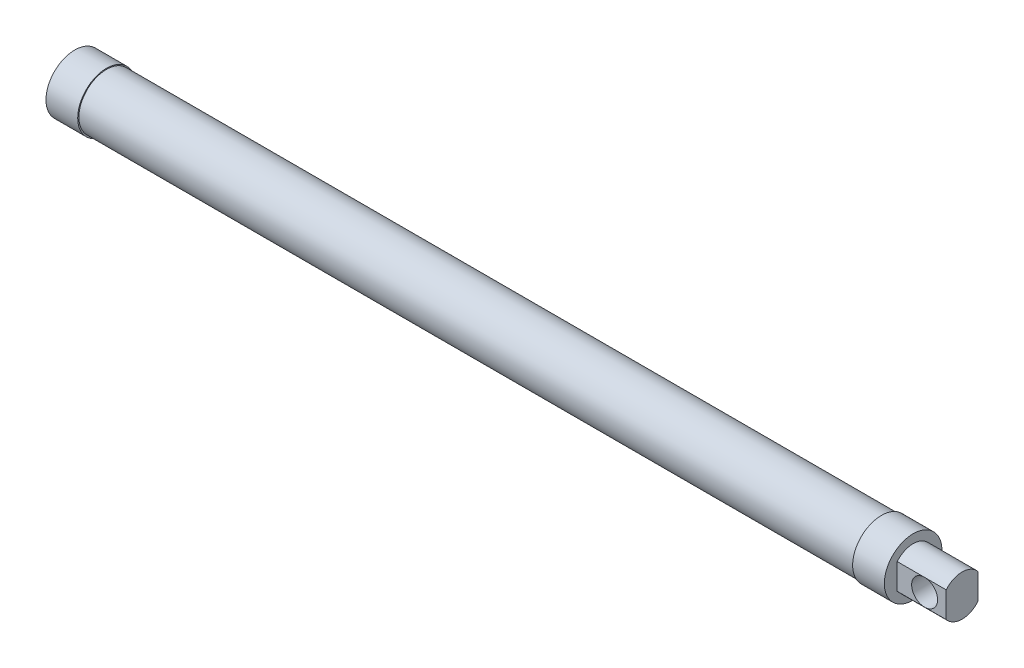
ISO-10303-21;
HEADER;
FILE_DESCRIPTION(('STEP AP214'),'2;1');
FILE_NAME('part.step','',(''),(''),'','','');
FILE_SCHEMA(('AUTOMOTIVE_DESIGN { 1 0 10303 214 1 1 1 1 }'));
ENDSEC;
DATA;
#1=APPLICATION_CONTEXT('core data for automotive mechanical design processes');
#2=APPLICATION_PROTOCOL_DEFINITION('international standard','automotive_design',2000,#1);
#3=PRODUCT_CONTEXT('',#1,'mechanical');
#4=PRODUCT('Part','Part','',(#3));
#5=PRODUCT_RELATED_PRODUCT_CATEGORY('part','',(#4));
#6=PRODUCT_DEFINITION_FORMATION('','',#4);
#7=PRODUCT_DEFINITION_CONTEXT('part definition',#1,'design');
#8=PRODUCT_DEFINITION('design','',#6,#7);
#9=PRODUCT_DEFINITION_SHAPE('','',#8);
#10=(LENGTH_UNIT() NAMED_UNIT(*) SI_UNIT(.MILLI.,.METRE.));
#11=(NAMED_UNIT(*) PLANE_ANGLE_UNIT() SI_UNIT($,.RADIAN.));
#12=(NAMED_UNIT(*) SI_UNIT($,.STERADIAN.) SOLID_ANGLE_UNIT());
#13=UNCERTAINTY_MEASURE_WITH_UNIT(LENGTH_MEASURE(1.E-05),#10,'distance_accuracy_value','');
#14=(GEOMETRIC_REPRESENTATION_CONTEXT(3) GLOBAL_UNCERTAINTY_ASSIGNED_CONTEXT((#13)) GLOBAL_UNIT_ASSIGNED_CONTEXT((#10,
#11,#12)) REPRESENTATION_CONTEXT('',''));
#15=CARTESIAN_POINT('',(0.,0.,0.));
#16=DIRECTION('',(0.,0.,1.));
#17=DIRECTION('',(1.,0.,0.));
#18=AXIS2_PLACEMENT_3D('',#15,#16,#17);
#19=CARTESIAN_POINT('',(177.187319621191,3.33623900999598,0.));
#20=DIRECTION('',(-1.,0.,0.));
#21=DIRECTION('',(0.,0.,1.));
#22=AXIS2_PLACEMENT_3D('',#19,#20,#21);
#23=CYLINDRICAL_SURFACE('',#22,7.1);
#24=CARTESIAN_POINT('',(177.187319621191,3.33623900999598,0.));
#25=DIRECTION('',(1.,0.,0.));
#26=DIRECTION('',(0.,0.,-1.));
#27=AXIS2_PLACEMENT_3D('',#24,#25,#26);
#28=CIRCLE('',#27,7.1);
#29=CARTESIAN_POINT('',(177.187319621191,-1.13477025863525,5.5154397938708));
#30=VERTEX_POINT('',#29);
#31=CARTESIAN_POINT('',(177.187319621191,-1.13477025863525,-5.51543979387081));
#32=VERTEX_POINT('',#31);
#33=EDGE_CURVE('E149',#30,#32,#28,.T.);
#34=ORIENTED_EDGE('',*,*,#33,.F.);
#35=DIRECTION('',(-1.,0.,0.));
#36=VECTOR('',#35,1.);
#37=CARTESIAN_POINT('',(177.187319621191,-1.13477025863525,5.5154397938708));
#38=LINE('',#37,#36);
#39=CARTESIAN_POINT('',(170.197296208706,-1.13477025863525,5.5154397938708));
#40=VERTEX_POINT('',#39);
#41=EDGE_CURVE('E126',#30,#40,#38,.T.);
#42=ORIENTED_EDGE('',*,*,#41,.T.);
#43=CARTESIAN_POINT('',(174.187319621191,3.33623900999598,7.1));
#44=CARTESIAN_POINT('',(174.187319822801,3.2221462870778,7.10000017468691));
#45=CARTESIAN_POINT('',(174.182975004574,3.10805580806622,7.0972439689678));
#46=CARTESIAN_POINT('',(174.165659884058,2.88075405835197,7.08628866078498));
#47=CARTESIAN_POINT('',(174.152686298407,2.76754313892959,7.07808748643944));
#48=CARTESIAN_POINT('',(174.118274374628,2.54278032945729,7.05642824695774));
#49=CARTESIAN_POINT('',(174.096825627781,2.43123065512805,7.04296371788206));
#50=CARTESIAN_POINT('',(174.045763715331,2.21071761872128,7.01110860920865));
#51=CARTESIAN_POINT('',(174.01614710714,2.10175536826965,6.99271595259767));
#52=CARTESIAN_POINT('',(173.915931923959,1.78101452943379,6.93097039410667));
#53=CARTESIAN_POINT('',(173.833751919232,1.57400777414716,6.88090979401731));
#54=CARTESIAN_POINT('',(173.641911906617,1.17757740354885,6.76704240773198));
#55=CARTESIAN_POINT('',(173.532253709177,0.988152630943864,6.70323652720671));
#56=CARTESIAN_POINT('',(173.278787006707,0.614784840823642,6.56100095804514));
#57=CARTESIAN_POINT('',(173.132931975307,0.432528261686761,6.48180541872513));
#58=CARTESIAN_POINT('',(172.815873899652,0.0933789031045517,6.31896279203119));
#59=CARTESIAN_POINT('',(172.644636262685,-0.0634786410341734,6.23530973097012));
#60=CARTESIAN_POINT('',(172.35794876501,-0.288014927211799,6.10603548736405));
#61=CARTESIAN_POINT('',(172.250126287342,-0.365060422732464,6.05951110787581));
#62=CARTESIAN_POINT('',(172.027440491518,-0.509732692259666,5.96873474997877));
#63=CARTESIAN_POINT('',(171.912575803467,-0.577357625295439,5.92448321679433));
#64=CARTESIAN_POINT('',(171.558253141131,-0.765076581411033,5.79758214502196));
#65=CARTESIAN_POINT('',(171.308496391546,-0.870464379741563,5.72051409074891));
#66=CARTESIAN_POINT('',(170.856891255916,-1.01374842726759,5.6119058204563));
#67=CARTESIAN_POINT('',(170.659932556602,-1.06213540670671,5.57371029574015));
#68=CARTESIAN_POINT('',(170.258537002137,-1.13198616832087,5.51788163032777));
#69=CARTESIAN_POINT('',(170.054111641753,-1.15348967648165,5.50021815193157));
#70=CARTESIAN_POINT('',(169.642940943119,-1.16825544818857,5.48813705630943));
#71=CARTESIAN_POINT('',(169.436190613859,-1.16143607289796,5.49378663713125));
#72=CARTESIAN_POINT('',(169.027332762666,-1.11984869020633,5.5275622791075));
#73=CARTESIAN_POINT('',(168.825229167668,-1.08505787711481,5.55570668064342));
#74=CARTESIAN_POINT('',(168.436265296039,-0.990872240326258,5.62934412615362));
#75=CARTESIAN_POINT('',(168.249141530718,-0.932162553316856,5.67435146987763));
#76=CARTESIAN_POINT('',(167.887052503605,-0.79252994181986,5.77674137421424));
#77=CARTESIAN_POINT('',(167.712091529111,-0.71159923383476,5.83412826957826));
#78=CARTESIAN_POINT('',(167.343819658091,-0.512119870575905,5.96801138512378));
#79=CARTESIAN_POINT('',(167.153374309828,-0.389340337080219,6.0460646693607));
#80=CARTESIAN_POINT('',(166.793597110087,-0.117347473687728,6.20544862330606));
#81=CARTESIAN_POINT('',(166.624287684456,0.0318935331615528,6.28678265497488));
#82=CARTESIAN_POINT('',(166.374163278536,0.288194373047995,6.41331919078514));
#83=CARTESIAN_POINT('',(166.285625558142,0.387303707542571,6.45960330555773));
#84=CARTESIAN_POINT('',(166.117219349213,0.593594236833106,6.54985157368386));
#85=CARTESIAN_POINT('',(166.03734775519,0.70077251666301,6.59381655517257));
#86=CARTESIAN_POINT('',(165.886882838155,0.922803547018571,6.67828158487408));
#87=CARTESIAN_POINT('',(165.816292531942,1.03765877466008,6.71878050498871));
#88=CARTESIAN_POINT('',(165.6851968693,1.27437069117977,6.7951563167181));
#89=CARTESIAN_POINT('',(165.624685305358,1.39622300787853,6.83103605018165));
#90=CARTESIAN_POINT('',(165.517210621043,1.6400505503586,6.89550968024111));
#91=CARTESIAN_POINT('',(165.469726799152,1.7617238183177,6.92437548218715));
#92=CARTESIAN_POINT('',(165.385252735071,2.00982358047668,6.97614974328856));
#93=CARTESIAN_POINT('',(165.348256369068,2.13624725178119,6.99906167835911));
#94=CARTESIAN_POINT('',(165.285368333518,2.39271383735925,7.03822207545592));
#95=CARTESIAN_POINT('',(165.259466014194,2.52275315246863,7.05447692731832));
#96=CARTESIAN_POINT('',(165.219201484088,2.78528845220953,7.07981871387365));
#97=CARTESIAN_POINT('',(165.204837165484,2.91778398359971,7.08890695779472));
#98=CARTESIAN_POINT('',(165.189221291859,3.16343924341268,7.09879295885256));
#99=CARTESIAN_POINT('',(165.186299085679,3.2764541730202,7.10064682626194));
#100=CARTESIAN_POINT('',(165.188968617891,3.50238129497822,7.0989548615753));
#101=CARTESIAN_POINT('',(165.194562948828,3.61529344557094,7.09540738524007));
#102=CARTESIAN_POINT('',(165.21418840419,3.84003472826551,7.08299681435742));
#103=CARTESIAN_POINT('',(165.228215505166,3.95186435102542,7.07413625479829));
#104=CARTESIAN_POINT('',(165.264496430829,4.17366815551142,7.05132418659108));
#105=CARTESIAN_POINT('',(165.286753419456,4.28364160661709,7.03737072002739));
#106=CARTESIAN_POINT('',(165.363081367485,4.59971898215306,6.98981073369491));
#107=CARTESIAN_POINT('',(165.427689559155,4.80244302594364,6.94986321870985));
#108=CARTESIAN_POINT('',(165.583176065215,5.1937815108335,6.8556686124754));
#109=CARTESIAN_POINT('',(165.674058559206,5.38239370106755,6.80141924627155));
#110=CARTESIAN_POINT('',(165.8894253945,5.7606853564799,6.67649133254053));
#111=CARTESIAN_POINT('',(166.01635058268,5.94861022259833,6.60471617288724));
#112=CARTESIAN_POINT('',(166.295200014094,6.30175081727969,6.45389099668333));
#113=CARTESIAN_POINT('',(166.447151197398,6.46694171744095,6.37483318133815));
#114=CARTESIAN_POINT('',(166.797951293098,6.79567339996258,6.20335209090004));
#115=CARTESIAN_POINT('',(167.000415784394,6.95525673771319,6.11070141004099));
#116=CARTESIAN_POINT('',(167.432096942824,7.23888237114302,5.93357583948149));
#117=CARTESIAN_POINT('',(167.661298968131,7.36294399158982,5.84909652096934));
#118=CARTESIAN_POINT('',(168.093979867368,7.54987351999425,5.71539434119586));
#119=CARTESIAN_POINT('',(168.293100685703,7.62007231114351,5.66249415787162));
#120=CARTESIAN_POINT('',(168.600372289457,7.70428713051538,5.59744550651184));
#121=CARTESIAN_POINT('',(168.704203589376,7.72884169130594,5.57814895750223));
#122=CARTESIAN_POINT('',(168.914167254653,7.770613236262,5.54500161577246));
#123=CARTESIAN_POINT('',(169.020298577873,7.78783347345705,5.53114840895085));
#124=CARTESIAN_POINT('',(169.234864438124,7.81474944700493,5.50937814108585));
#125=CARTESIAN_POINT('',(169.343309759811,7.8243929457109,5.50150230330976));
#126=CARTESIAN_POINT('',(169.560893044211,7.83578164000262,5.49219181878344));
#127=CARTESIAN_POINT('',(169.670031001376,7.83752689875038,5.49075712052358));
#128=CARTESIAN_POINT('',(169.888062024369,7.83308118853608,5.49439901367898));
#129=CARTESIAN_POINT('',(169.996955035228,7.82688858770814,5.49947694396111));
#130=CARTESIAN_POINT('',(170.213505042107,7.80669447190271,5.51590305298396));
#131=CARTESIAN_POINT('',(170.321162066242,7.79269313492173,5.52725108880049));
#132=CARTESIAN_POINT('',(170.621122905286,7.74263584440796,5.56735428446598));
#133=CARTESIAN_POINT('',(170.811170246422,7.69790329027658,5.60276169422728));
#134=CARTESIAN_POINT('',(171.180709432718,7.58561721078336,5.68838294776465));
#135=CARTESIAN_POINT('',(171.36019651534,7.5180534800924,5.73860341156323));
#136=CARTESIAN_POINT('',(171.730830772497,7.35132397202905,5.85669783999775));
#137=CARTESIAN_POINT('',(171.920106466599,7.24906279259575,5.92605765693715));
#138=CARTESIAN_POINT('',(172.280606251634,7.02006020385713,6.07106637891151));
#139=CARTESIAN_POINT('',(172.451816064693,6.89329965287402,6.14672017501701));
#140=CARTESIAN_POINT('',(172.808581038328,6.58798559615199,6.31446913426231));
#141=CARTESIAN_POINT('',(172.989589755156,6.40414592941027,6.4066783568609));
#142=CARTESIAN_POINT('',(173.319402207369,6.00547006670143,6.58274994778888));
#143=CARTESIAN_POINT('',(173.468182584706,5.79061157600359,6.66660623856778));
#144=CARTESIAN_POINT('',(173.66408666848,5.44648989167294,6.7802530779917));
#145=CARTESIAN_POINT('',(173.725219431852,5.32709983418743,6.8163506909064));
#146=CARTESIAN_POINT('',(173.837023104585,5.08210835128659,6.88316929025596));
#147=CARTESIAN_POINT('',(173.88770000184,4.95651053232426,6.9138933524868));
#148=CARTESIAN_POINT('',(173.977727640456,4.700345555308,6.96895533323447));
#149=CARTESIAN_POINT('',(174.01710770171,4.56979227563277,6.99330976873641));
#150=CARTESIAN_POINT('',(174.084005773523,4.30465020568659,7.03492435181861));
#151=CARTESIAN_POINT('',(174.111532109528,4.17006431900393,7.05218947816738));
#152=CARTESIAN_POINT('',(174.15092879927,3.91912500567542,7.0769777318157));
#153=CARTESIAN_POINT('',(174.164556087279,3.80315150991018,7.08559088292554));
#154=CARTESIAN_POINT('',(174.182751638951,3.57019759575971,7.09710208144077));
#155=CARTESIAN_POINT('',(174.187319414482,3.45321712345886,7.09999982089527));
#156=CARTESIAN_POINT('',(174.187319621191,3.33623900999598,7.1));
#157=B_SPLINE_CURVE_WITH_KNOTS('',3,(#43,#44,#45,#46,#47,#48,#49,#50,#51,#52,#53,#54,#55,#56,
#57,#58,#59,#60,#61,#62,#63,#64,#65,#66,#67,#68,#69,#70,#71,#72,#73,#74,#75,#76,#77,#78,#79,#80,
#81,#82,#83,#84,#85,#86,#87,#88,#89,#90,#91,#92,#93,#94,#95,#96,#97,#98,#99,#100,#101,#102,#103,
#104,#105,#106,#107,#108,#109,#110,#111,#112,#113,#114,#115,#116,#117,#118,#119,#120,#121,#122,
#123,#124,#125,#126,#127,#128,#129,#130,#131,#132,#133,#134,#135,#136,#137,#138,#139,#140,#141,
#142,#143,#144,#145,#146,#147,#148,#149,#150,#151,#152,#153,#154,#155,#156),.UNSPECIFIED.,.T.,
.F.,(4,2,2,2,2,2,2,2,2,2,2,2,2,2,2,2,2,2,2,2,2,2,2,2,2,2,2,2,2,2,2,2,2,2,2,2,2,2,2,2,2,2,2,2,2,
2,2,2,2,2,2,2,2,2,2,2,4),(0.,0.342158644756694,0.684447560032412,1.02715816858447,
1.37001344408913,2.05158390893876,2.73310947912811,3.46983108818623,4.20756613103727,
4.62844410837365,5.04940421884894,5.88902778722157,6.50569223724281,7.12144435453223,
7.73897256647683,8.35700477311632,8.95845594718548,9.5601180647173,10.2765440289525,
10.9937237959002,11.415457664635,11.837039903297,12.2587588365214,12.6802170641803,
13.0809065157806,13.4813615134386,13.8814312262752,14.2814278356366,14.6201950122119,
14.9590653345373,15.2977741029216,15.6366132217887,16.2831090976722,16.929707871914,
17.6405275993631,18.3521175747867,19.1703505614751,19.9881375579769,20.6382891663438,
20.9632189665191,21.2880044984797,21.6150100735643,21.942013033589,22.2690832296937,
22.5961459706901,23.1888077891074,23.7817348731822,24.4574554881214,25.1337062023574,
25.9520707189898,26.7710263895776,27.1872087644749,27.6031521332349,28.0180059848841,
28.4325679874219,28.7833608805854,29.1341726742294),.UNSPECIFIED.);
#158=CARTESIAN_POINT('',(169.177343033676,-1.13477025863525,5.5154397938708));
#159=VERTEX_POINT('',#158);
#160=EDGE_CURVE('E153',#40,#159,#157,.T.);
#161=ORIENTED_EDGE('',*,*,#160,.T.);
#162=CARTESIAN_POINT('',(160.187319621191,-1.13477025863525,5.5154397938708));
#163=VERTEX_POINT('',#162);
#164=EDGE_CURVE('E60',#159,#163,#38,.T.);
#165=ORIENTED_EDGE('',*,*,#164,.T.);
#166=CARTESIAN_POINT('',(160.187319621191,3.33623900999598,0.));
#167=DIRECTION('',(1.,0.,0.));
#168=DIRECTION('',(0.,0.,-1.));
#169=AXIS2_PLACEMENT_3D('',#166,#167,#168);
#170=CIRCLE('',#169,7.1);
#171=CARTESIAN_POINT('',(160.187319621191,-1.13477025863525,-5.51543979387081));
#172=VERTEX_POINT('',#171);
#173=EDGE_CURVE('E159',#163,#172,#170,.T.);
#174=ORIENTED_EDGE('',*,*,#173,.T.);
#175=DIRECTION('',(-1.,0.,0.));
#176=VECTOR('',#175,1.);
#177=CARTESIAN_POINT('',(177.187319621191,-1.13477025863525,-5.51543979387081));
#178=LINE('',#177,#176);
#179=CARTESIAN_POINT('',(169.177343033676,-1.13477025863525,-5.51543979387081));
#180=VERTEX_POINT('',#179);
#181=EDGE_CURVE('E261',#172,#180,#178,.F.);
#182=ORIENTED_EDGE('',*,*,#181,.T.);
#183=CARTESIAN_POINT('',(174.187319621191,3.33623900999598,-7.1));
#184=CARTESIAN_POINT('',(174.187319822801,3.45033173291415,-7.10000017468691));
#185=CARTESIAN_POINT('',(174.182975004574,3.56442221192573,-7.0972439689678));
#186=CARTESIAN_POINT('',(174.165659884058,3.79172396163999,-7.08628866078498));
#187=CARTESIAN_POINT('',(174.152686298407,3.90493488106236,-7.07808748643944));
#188=CARTESIAN_POINT('',(174.118274374628,4.12969769053466,-7.05642824695774));
#189=CARTESIAN_POINT('',(174.096825627781,4.2412473648639,-7.04296371788206));
#190=CARTESIAN_POINT('',(174.045763715331,4.46176040127067,-7.01110860920865));
#191=CARTESIAN_POINT('',(174.01614710714,4.5707226517223,-6.99271595259767));
#192=CARTESIAN_POINT('',(173.915931923959,4.89146349055816,-6.93097039410667));
#193=CARTESIAN_POINT('',(173.833751919232,5.0984702458448,-6.88090979401731));
#194=CARTESIAN_POINT('',(173.641911906617,5.49490061644311,-6.76704240773198));
#195=CARTESIAN_POINT('',(173.532253709177,5.68432538904809,-6.70323652720671));
#196=CARTESIAN_POINT('',(173.278787006707,6.05769317916832,-6.56100095804514));
#197=CARTESIAN_POINT('',(173.132931975307,6.2399497583052,-6.48180541872513));
#198=CARTESIAN_POINT('',(172.815873899652,6.57909911688741,-6.31896279203119));
#199=CARTESIAN_POINT('',(172.644636262685,6.73595666102613,-6.23530973097012));
#200=CARTESIAN_POINT('',(172.35794876501,6.96049294720376,-6.10603548736405));
#201=CARTESIAN_POINT('',(172.250126287342,7.03753844272442,-6.05951110787581));
#202=CARTESIAN_POINT('',(172.027440491518,7.18221071225162,-5.96873474997877));
#203=CARTESIAN_POINT('',(171.912575803467,7.2498356452874,-5.92448321679433));
#204=CARTESIAN_POINT('',(171.558253141131,7.43755460140299,-5.79758214502196));
#205=CARTESIAN_POINT('',(171.308496391546,7.54294239973352,-5.72051409074891));
#206=CARTESIAN_POINT('',(170.856891255916,7.68622644725955,-5.6119058204563));
#207=CARTESIAN_POINT('',(170.659932556602,7.73461342669867,-5.57371029574015));
#208=CARTESIAN_POINT('',(170.258537002137,7.80446418831283,-5.51788163032777));
#209=CARTESIAN_POINT('',(170.054111641753,7.82596769647361,-5.50021815193157));
#210=CARTESIAN_POINT('',(169.642940943119,7.84073346818053,-5.48813705630944));
#211=CARTESIAN_POINT('',(169.436190613859,7.83391409288992,-5.49378663713125));
#212=CARTESIAN_POINT('',(169.027332762666,7.79232671019828,-5.5275622791075));
#213=CARTESIAN_POINT('',(168.825229167668,7.75753589710677,-5.55570668064342));
#214=CARTESIAN_POINT('',(168.436265296039,7.66335026031822,-5.62934412615362));
#215=CARTESIAN_POINT('',(168.249141530718,7.60464057330881,-5.67435146987763));
#216=CARTESIAN_POINT('',(167.887052503605,7.46500796181182,-5.77674137421424));
#217=CARTESIAN_POINT('',(167.712091529111,7.38407725382672,-5.83412826957826));
#218=CARTESIAN_POINT('',(167.343819658091,7.18459789056786,-5.96801138512378));
#219=CARTESIAN_POINT('',(167.153374309828,7.06181835707218,-6.0460646693607));
#220=CARTESIAN_POINT('',(166.793597110087,6.78982549367969,-6.20544862330606));
#221=CARTESIAN_POINT('',(166.624287684456,6.6405844868304,-6.28678265497488));
#222=CARTESIAN_POINT('',(166.374163278536,6.38428364694396,-6.41331919078514));
#223=CARTESIAN_POINT('',(166.285625558142,6.28517431244939,-6.45960330555773));
#224=CARTESIAN_POINT('',(166.117219349213,6.07888378315885,-6.54985157368386));
#225=CARTESIAN_POINT('',(166.03734775519,5.97170550332895,-6.59381655517257));
#226=CARTESIAN_POINT('',(165.886882838155,5.74967447297339,-6.67828158487408));
#227=CARTESIAN_POINT('',(165.816292531942,5.63481924533187,-6.71878050498871));
#228=CARTESIAN_POINT('',(165.6851968693,5.39810732881218,-6.7951563167181));
#229=CARTESIAN_POINT('',(165.624685305358,5.27625501211343,-6.83103605018165));
#230=CARTESIAN_POINT('',(165.517210621043,5.03242746963335,-6.89550968024111));
#231=CARTESIAN_POINT('',(165.469726799152,4.91075420167425,-6.92437548218715));
#232=CARTESIAN_POINT('',(165.385252735071,4.66265443951528,-6.97614974328856));
#233=CARTESIAN_POINT('',(165.348256369068,4.53623076821077,-6.99906167835911));
#234=CARTESIAN_POINT('',(165.285368333518,4.2797641826327,-7.03822207545592));
#235=CARTESIAN_POINT('',(165.259466014194,4.14972486752333,-7.05447692731832));
#236=CARTESIAN_POINT('',(165.219201484088,3.88718956778242,-7.07981871387365));
#237=CARTESIAN_POINT('',(165.204837165484,3.75469403639225,-7.08890695779472));
#238=CARTESIAN_POINT('',(165.189221291859,3.50903877657927,-7.09879295885256));
#239=CARTESIAN_POINT('',(165.186299085679,3.39602384697175,-7.10064682626194));
#240=CARTESIAN_POINT('',(165.188968617891,3.17009672501373,-7.09895486157531));
#241=CARTESIAN_POINT('',(165.194562948828,3.05718457442102,-7.09540738524007));
#242=CARTESIAN_POINT('',(165.21418840419,2.83244329172644,-7.08299681435742));
#243=CARTESIAN_POINT('',(165.228215505166,2.72061366896653,-7.07413625479829));
#244=CARTESIAN_POINT('',(165.264496430829,2.49880986448053,-7.05132418659108));
#245=CARTESIAN_POINT('',(165.286753419456,2.38883641337486,-7.03737072002739));
#246=CARTESIAN_POINT('',(165.363081367485,2.07275903783889,-6.98981073369491));
#247=CARTESIAN_POINT('',(165.427689559155,1.87003499404832,-6.94986321870985));
#248=CARTESIAN_POINT('',(165.583176065215,1.47869650915845,-6.8556686124754));
#249=CARTESIAN_POINT('',(165.674058559206,1.2900843189244,-6.80141924627154));
#250=CARTESIAN_POINT('',(165.8894253945,0.911792663512055,-6.67649133254053));
#251=CARTESIAN_POINT('',(166.01635058268,0.723867797393625,-6.60471617288724));
#252=CARTESIAN_POINT('',(166.295200014094,0.370727202712265,-6.45389099668333));
#253=CARTESIAN_POINT('',(166.447151197398,0.205536302551004,-6.37483318133815));
#254=CARTESIAN_POINT('',(166.797951293098,-0.123195379970626,-6.20335209090004));
#255=CARTESIAN_POINT('',(167.000415784394,-0.282778717721228,-6.11070141004099));
#256=CARTESIAN_POINT('',(167.432096942824,-0.566404351151059,-5.93357583948149));
#257=CARTESIAN_POINT('',(167.661298968131,-0.690465971597861,-5.84909652096934));
#258=CARTESIAN_POINT('',(168.093979867368,-0.877395500002297,-5.71539434119586));
#259=CARTESIAN_POINT('',(168.293100685703,-0.947594291151556,-5.66249415787162));
#260=CARTESIAN_POINT('',(168.600372289457,-1.03180911052343,-5.59744550651183));
#261=CARTESIAN_POINT('',(168.704203589376,-1.05636367131398,-5.57814895750223));
#262=CARTESIAN_POINT('',(168.914167254653,-1.09813521627004,-5.54500161577246));
#263=CARTESIAN_POINT('',(169.020298577873,-1.11535545346509,-5.53114840895085));
#264=CARTESIAN_POINT('',(169.234864438124,-1.14227142701297,-5.50937814108585));
#265=CARTESIAN_POINT('',(169.343309759811,-1.15191492571895,-5.50150230330976));
#266=CARTESIAN_POINT('',(169.560893044211,-1.16330362001066,-5.49219181878344));
#267=CARTESIAN_POINT('',(169.670031001376,-1.16504887875842,-5.49075712052358));
#268=CARTESIAN_POINT('',(169.888062024369,-1.16060316854412,-5.49439901367899));
#269=CARTESIAN_POINT('',(169.996955035228,-1.15441056771618,-5.49947694396111));
#270=CARTESIAN_POINT('',(170.213505042107,-1.13421645191075,-5.51590305298397));
#271=CARTESIAN_POINT('',(170.321162066242,-1.12021511492976,-5.5272510888005));
#272=CARTESIAN_POINT('',(170.621122905286,-1.070157824416,-5.56735428446598));
#273=CARTESIAN_POINT('',(170.811170246422,-1.02542527028462,-5.60276169422729));
#274=CARTESIAN_POINT('',(171.180709432718,-0.913139190791391,-5.68838294776466));
#275=CARTESIAN_POINT('',(171.36019651534,-0.845575460100434,-5.73860341156324));
#276=CARTESIAN_POINT('',(171.730830772497,-0.67884595203708,-5.85669783999776));
#277=CARTESIAN_POINT('',(171.920106466599,-0.576584772603784,-5.92605765693716));
#278=CARTESIAN_POINT('',(172.280606251634,-0.347582183865173,-6.07106637891151));
#279=CARTESIAN_POINT('',(172.451816064693,-0.22082163288206,-6.14672017501701));
#280=CARTESIAN_POINT('',(172.808581038328,0.0844924238399771,-6.31446913426231));
#281=CARTESIAN_POINT('',(172.989589755156,0.268332090581704,-6.40667835686091));
#282=CARTESIAN_POINT('',(173.319402207369,0.667007953290552,-6.58274994778889));
#283=CARTESIAN_POINT('',(173.468182584706,0.881866443988376,-6.66660623856779));
#284=CARTESIAN_POINT('',(173.66408666848,1.22598812831903,-6.7802530779917));
#285=CARTESIAN_POINT('',(173.725219431852,1.34537818580454,-6.8163506909064));
#286=CARTESIAN_POINT('',(173.837023104585,1.59036966870539,-6.88316929025596));
#287=CARTESIAN_POINT('',(173.88770000184,1.71596748766772,-6.91389335248681));
#288=CARTESIAN_POINT('',(173.977727640456,1.97213246468398,-6.96895533323448));
#289=CARTESIAN_POINT('',(174.01710770171,2.10268574435921,-6.99330976873641));
#290=CARTESIAN_POINT('',(174.084005773523,2.36782781430539,-7.03492435181862));
#291=CARTESIAN_POINT('',(174.111532109528,2.50241370098804,-7.05218947816738));
#292=CARTESIAN_POINT('',(174.15092879927,2.75335301431655,-7.0769777318157));
#293=CARTESIAN_POINT('',(174.164556087279,2.86932651008179,-7.08559088292554));
#294=CARTESIAN_POINT('',(174.182751638951,3.10228042423225,-7.09710208144077));
#295=CARTESIAN_POINT('',(174.187319414482,3.2192608965331,-7.09999982089527));
#296=CARTESIAN_POINT('',(174.187319621191,3.33623900999598,-7.1));
#297=B_SPLINE_CURVE_WITH_KNOTS('',3,(#183,#184,#185,#186,#187,#188,#189,#190,#191,#192,#193,
#194,#195,#196,#197,#198,#199,#200,#201,#202,#203,#204,#205,#206,#207,#208,#209,#210,#211,#212,
#213,#214,#215,#216,#217,#218,#219,#220,#221,#222,#223,#224,#225,#226,#227,#228,#229,#230,#231,
#232,#233,#234,#235,#236,#237,#238,#239,#240,#241,#242,#243,#244,#245,#246,#247,#248,#249,#250,
#251,#252,#253,#254,#255,#256,#257,#258,#259,#260,#261,#262,#263,#264,#265,#266,#267,#268,#269,
#270,#271,#272,#273,#274,#275,#276,#277,#278,#279,#280,#281,#282,#283,#284,#285,#286,#287,#288,
#289,#290,#291,#292,#293,#294,#295,#296),.UNSPECIFIED.,.T.,.F.,(4,2,2,2,2,2,2,2,2,2,2,2,2,2,2,2,
2,2,2,2,2,2,2,2,2,2,2,2,2,2,2,2,2,2,2,2,2,2,2,2,2,2,2,2,2,2,2,2,2,2,2,2,2,2,2,2,4),(0.,
0.342158644756691,0.684447560032407,1.02715816858446,1.37001344408913,2.05158390893876,
2.73310947912811,3.46983108818623,4.20756613103727,4.62844410837365,5.04940421884894,
5.88902778722157,6.50569223724281,7.12144435453223,7.73897256647683,8.35700477311632,
8.95845594718548,9.5601180647173,10.2765440289525,10.9937237959002,11.415457664635,
11.837039903297,12.2587588365214,12.6802170641803,13.0809065157806,13.4813615134386,
13.8814312262752,14.2814278356366,14.6201950122119,14.9590653345373,15.2977741029216,
15.6366132217887,16.2831090976722,16.929707871914,17.6405275993631,18.3521175747868,
19.1703505614751,19.9881375579769,20.6382891663438,20.9632189665191,21.2880044984797,
21.6150100735643,21.942013033589,22.2690832296938,22.5961459706901,23.1888077891075,
23.7817348731823,24.4574554881214,25.1337062023574,25.9520707189899,26.7710263895776,
27.1872087644749,27.603152133235,28.0180059848841,28.4325679874219,28.7833608805855,
29.1341726742294),.UNSPECIFIED.);
#298=CARTESIAN_POINT('',(170.197296208706,-1.13477025863525,-5.51543979387081));
#299=VERTEX_POINT('',#298);
#300=EDGE_CURVE('E220',#180,#299,#297,.T.);
#301=ORIENTED_EDGE('',*,*,#300,.T.);
#302=EDGE_CURVE('E256',#299,#32,#178,.F.);
#303=ORIENTED_EDGE('',*,*,#302,.T.);
#304=EDGE_LOOP('',(#34,#42,#161,#165,#174,#182,#301,#303));
#305=FACE_BOUND('',#304,.T.);
#306=ADVANCED_FACE('F37',(#305),#23,.T.);
#307=CARTESIAN_POINT('',(-119.812680378809,3.43579937304075,0.));
#308=DIRECTION('',(-1.,0.,0.));
#309=DIRECTION('',(0.,0.,1.));
#310=AXIS2_PLACEMENT_3D('',#307,#308,#309);
#311=CYLINDRICAL_SURFACE('',#310,9.58);
#312=CARTESIAN_POINT('',(-119.812680378809,3.43579937304075,0.));
#313=DIRECTION('',(-1.,0.,0.));
#314=DIRECTION('',(0.,0.,1.));
#315=AXIS2_PLACEMENT_3D('',#312,#313,#314);
#316=CIRCLE('',#315,9.58);
#317=CARTESIAN_POINT('',(-119.812680378809,3.43579937304075,9.58));
#318=VERTEX_POINT('',#317);
#319=EDGE_CURVE('E201',#318,#318,#316,.T.);
#320=ORIENTED_EDGE('',*,*,#319,.F.);
#321=EDGE_LOOP('',(#320));
#322=FACE_BOUND('',#321,.T.);
#323=CARTESIAN_POINT('',(149.187319621191,3.43579937304075,0.));
#324=DIRECTION('',(1.,0.,0.));
#325=DIRECTION('',(0.,0.,-1.));
#326=AXIS2_PLACEMENT_3D('',#323,#324,#325);
#327=CIRCLE('',#326,9.58);
#328=CARTESIAN_POINT('',(149.187319621191,3.43579937304075,-9.58));
#329=VERTEX_POINT('',#328);
#330=EDGE_CURVE('E193',#329,#329,#327,.F.);
#331=ORIENTED_EDGE('',*,*,#330,.T.);
#332=EDGE_LOOP('',(#331));
#333=FACE_BOUND('',#332,.T.);
#334=ADVANCED_FACE('F39',(#322,#333),#311,.T.);
#335=CARTESIAN_POINT('',(160.187319621191,3.43579937304075,0.));
#336=DIRECTION('',(-1.,0.,0.));
#337=DIRECTION('',(0.,0.,1.));
#338=AXIS2_PLACEMENT_3D('',#335,#336,#337);
#339=CYLINDRICAL_SURFACE('',#338,3.05);
#340=CARTESIAN_POINT('',(149.187319621191,3.43579937304075,0.));
#341=DIRECTION('',(1.,0.,0.));
#342=DIRECTION('',(0.,0.,-1.));
#343=AXIS2_PLACEMENT_3D('',#340,#341,#342);
#344=CIRCLE('',#343,3.05);
#345=CARTESIAN_POINT('',(149.187319621191,3.3981872068804,3.04976807724075));
#346=VERTEX_POINT('',#345);
#347=CARTESIAN_POINT('',(149.187319621191,3.3981872068804,-3.04976807724075));
#348=VERTEX_POINT('',#347);
#349=EDGE_CURVE('E204',#346,#348,#344,.F.);
#350=ORIENTED_EDGE('',*,*,#349,.F.);
#351=DIRECTION('',(1.,0.,0.));
#352=VECTOR('',#351,1.);
#353=CARTESIAN_POINT('',(20.1873256211908,3.3981872068804,3.04976807724075));
#354=LINE('',#353,#352);
#355=CARTESIAN_POINT('',(-119.812680378809,3.3981872068804,3.04976807724075));
#356=VERTEX_POINT('',#355);
#357=EDGE_CURVE('E186',#346,#356,#354,.F.);
#358=ORIENTED_EDGE('',*,*,#357,.T.);
#359=CARTESIAN_POINT('',(-119.812680378809,3.43579937304075,0.));
#360=DIRECTION('',(-1.,0.,0.));
#361=DIRECTION('',(0.,0.,1.));
#362=AXIS2_PLACEMENT_3D('',#359,#360,#361);
#363=CIRCLE('',#362,3.05);
#364=CARTESIAN_POINT('',(-119.812680378809,3.3981872068804,-3.04976807724075));
#365=VERTEX_POINT('',#364);
#366=EDGE_CURVE('E198',#356,#365,#363,.T.);
#367=ORIENTED_EDGE('',*,*,#366,.T.);
#368=DIRECTION('',(1.,0.,0.));
#369=VECTOR('',#368,1.);
#370=CARTESIAN_POINT('',(20.1873256211908,3.3981872068804,-3.04976807724075));
#371=LINE('',#370,#369);
#372=EDGE_CURVE('E183',#365,#348,#371,.T.);
#373=ORIENTED_EDGE('',*,*,#372,.T.);
#374=EDGE_LOOP('',(#350,#358,#367,#373));
#375=FACE_BOUND('',#374,.T.);
#376=ADVANCED_FACE('F250',(#375),#339,.F.);
#377=CARTESIAN_POINT('',(149.187319621191,3.43579937304075,0.));
#378=DIRECTION('',(1.,0.,0.));
#379=DIRECTION('',(0.,0.,-1.));
#380=AXIS2_PLACEMENT_3D('',#377,#378,#379);
#381=PLANE('',#380);
#382=ORIENTED_EDGE('',*,*,#349,.T.);
#383=CARTESIAN_POINT('',(149.187319621191,3.36057504072005,0.));
#384=DIRECTION('',(1.,0.,0.));
#385=DIRECTION('',(0.,0.,-1.));
#386=AXIS2_PLACEMENT_3D('',#383,#384,#385);
#387=CIRCLE('',#386,3.05);
#388=EDGE_CURVE('E180',#348,#346,#387,.T.);
#389=ORIENTED_EDGE('',*,*,#388,.T.);
#390=EDGE_LOOP('',(#382,#389));
#391=FACE_BOUND('',#390,.T.);
#392=ADVANCED_FACE('F353',(#391),#381,.F.);
#393=CARTESIAN_POINT('',(149.187319621191,3.43579937304075,0.));
#394=DIRECTION('',(1.,0.,0.));
#395=DIRECTION('',(0.,0.,-1.));
#396=AXIS2_PLACEMENT_3D('',#393,#394,#395);
#397=CYLINDRICAL_SURFACE('',#396,10.);
#398=CARTESIAN_POINT('',(149.187319621191,3.43579937304075,0.));
#399=DIRECTION('',(1.,0.,0.));
#400=DIRECTION('',(0.,0.,-1.));
#401=AXIS2_PLACEMENT_3D('',#398,#399,#400);
#402=CIRCLE('',#401,10.);
#403=CARTESIAN_POINT('',(149.187319621191,3.43579937304075,-10.));
#404=VERTEX_POINT('',#403);
#405=EDGE_CURVE('E190',#404,#404,#402,.T.);
#406=ORIENTED_EDGE('',*,*,#405,.T.);
#407=EDGE_LOOP('',(#406));
#408=FACE_BOUND('',#407,.T.);
#409=CARTESIAN_POINT('',(160.187319621191,3.43579937304075,0.));
#410=DIRECTION('',(1.,0.,0.));
#411=DIRECTION('',(0.,0.,-1.));
#412=AXIS2_PLACEMENT_3D('',#409,#410,#411);
#413=CIRCLE('',#412,10.);
#414=CARTESIAN_POINT('',(160.187319621191,3.43579937304075,-10.));
#415=VERTEX_POINT('',#414);
#416=EDGE_CURVE('E189',#415,#415,#413,.T.);
#417=ORIENTED_EDGE('',*,*,#416,.F.);
#418=EDGE_LOOP('',(#417));
#419=FACE_BOUND('',#418,.T.);
#420=ADVANCED_FACE('F348',(#408,#419),#397,.T.);
#421=ORIENTED_EDGE('',*,*,#330,.F.);
#422=EDGE_LOOP('',(#421));
#423=FACE_BOUND('',#422,.T.);
#424=ORIENTED_EDGE('',*,*,#405,.F.);
#425=EDGE_LOOP('',(#424));
#426=FACE_BOUND('',#425,.T.);
#427=ADVANCED_FACE('F341',(#423,#426),#381,.F.);
#428=CARTESIAN_POINT('',(160.187319621191,3.43579937304075,0.));
#429=DIRECTION('',(1.,0.,0.));
#430=DIRECTION('',(0.,0.,-1.));
#431=AXIS2_PLACEMENT_3D('',#428,#429,#430);
#432=PLANE('',#431);
#433=ORIENTED_EDGE('',*,*,#173,.F.);
#434=DIRECTION('',(0.,-1.,0.));
#435=VECTOR('',#434,1.);
#436=CARTESIAN_POINT('',(160.187319621191,7.80724827862721,5.51543979387081));
#437=LINE('',#436,#435);
#438=CARTESIAN_POINT('',(160.187319621191,7.80724827862721,5.51543979387081));
#439=VERTEX_POINT('',#438);
#440=EDGE_CURVE('E262',#439,#163,#437,.T.);
#441=ORIENTED_EDGE('',*,*,#440,.F.);
#442=CARTESIAN_POINT('',(160.187319621191,7.80724827862721,-5.51543979387081));
#443=VERTEX_POINT('',#442);
#444=EDGE_CURVE('E157',#443,#439,#170,.T.);
#445=ORIENTED_EDGE('',*,*,#444,.F.);
#446=DIRECTION('',(0.,1.,0.));
#447=VECTOR('',#446,1.);
#448=CARTESIAN_POINT('',(160.187319621191,7.80724827862721,-5.51543979387081));
#449=LINE('',#448,#447);
#450=EDGE_CURVE('E131',#172,#443,#449,.T.);
#451=ORIENTED_EDGE('',*,*,#450,.F.);
#452=EDGE_LOOP('',(#433,#441,#445,#451));
#453=FACE_BOUND('',#452,.T.);
#454=ORIENTED_EDGE('',*,*,#416,.T.);
#455=EDGE_LOOP('',(#454));
#456=FACE_BOUND('',#455,.T.);
#457=ADVANCED_FACE('F277',(#453,#456),#432,.T.);
#458=CARTESIAN_POINT('',(-119.812680378809,3.36057504072005,0.));
#459=DIRECTION('',(1.,0.,0.));
#460=DIRECTION('',(0.,0.,-1.));
#461=AXIS2_PLACEMENT_3D('',#458,#459,#460);
#462=CYLINDRICAL_SURFACE('',#461,3.05);
#463=CARTESIAN_POINT('',(-119.812680378809,3.36057504072005,0.));
#464=DIRECTION('',(1.,0.,0.));
#465=DIRECTION('',(0.,0.,-1.));
#466=AXIS2_PLACEMENT_3D('',#463,#464,#465);
#467=CIRCLE('',#466,3.05);
#468=CARTESIAN_POINT('',(-119.812680378809,3.34840702535801,-3.04997572767426));
#469=VERTEX_POINT('',#468);
#470=EDGE_CURVE('E173',#469,#365,#467,.T.);
#471=ORIENTED_EDGE('',*,*,#470,.F.);
#472=DIRECTION('',(-1.,0.,0.));
#473=VECTOR('',#472,1.);
#474=CARTESIAN_POINT('',(14.6873136211908,3.34840702535801,-3.04997572767426));
#475=LINE('',#474,#473);
#476=CARTESIAN_POINT('',(160.187319621191,3.34840702535801,-3.04997572767426));
#477=VERTEX_POINT('',#476);
#478=EDGE_CURVE('E163',#469,#477,#475,.F.);
#479=ORIENTED_EDGE('',*,*,#478,.T.);
#480=CARTESIAN_POINT('',(160.187319621191,3.36057504072005,0.));
#481=DIRECTION('',(1.,0.,0.));
#482=DIRECTION('',(0.,0.,-1.));
#483=AXIS2_PLACEMENT_3D('',#480,#481,#482);
#484=CIRCLE('',#483,3.05);
#485=CARTESIAN_POINT('',(160.187319621191,3.34840702535801,3.04997572767426));
#486=VERTEX_POINT('',#485);
#487=EDGE_CURVE('E179',#477,#486,#484,.T.);
#488=ORIENTED_EDGE('',*,*,#487,.T.);
#489=DIRECTION('',(-1.,0.,0.));
#490=VECTOR('',#489,1.);
#491=CARTESIAN_POINT('',(14.6873136211908,3.34840702535801,3.04997572767426));
#492=LINE('',#491,#490);
#493=CARTESIAN_POINT('',(-119.812680378809,3.34840702535801,3.04997572767426));
#494=VERTEX_POINT('',#493);
#495=EDGE_CURVE('E151',#486,#494,#492,.T.);
#496=ORIENTED_EDGE('',*,*,#495,.T.);
#497=EDGE_CURVE('E176',#356,#494,#467,.T.);
#498=ORIENTED_EDGE('',*,*,#497,.F.);
#499=ORIENTED_EDGE('',*,*,#357,.F.);
#500=ORIENTED_EDGE('',*,*,#388,.F.);
#501=ORIENTED_EDGE('',*,*,#372,.F.);
#502=EDGE_LOOP('',(#471,#479,#488,#496,#498,#499,#500,#501));
#503=FACE_BOUND('',#502,.T.);
#504=ADVANCED_FACE('F340',(#503),#462,.F.);
#505=CARTESIAN_POINT('',(-119.812680378809,3.36057504072005,0.));
#506=DIRECTION('',(-1.,0.,0.));
#507=DIRECTION('',(0.,0.,1.));
#508=AXIS2_PLACEMENT_3D('',#505,#506,#507);
#509=PLANE('',#508);
#510=ORIENTED_EDGE('',*,*,#319,.T.);
#511=EDGE_LOOP('',(#510));
#512=FACE_BOUND('',#511,.T.);
#513=CARTESIAN_POINT('',(-119.812680378809,3.36057504072005,0.));
#514=DIRECTION('',(-1.,0.,0.));
#515=DIRECTION('',(0.,0.,1.));
#516=AXIS2_PLACEMENT_3D('',#513,#514,#515);
#517=CIRCLE('',#516,10.);
#518=CARTESIAN_POINT('',(-119.812680378809,3.36057504072005,10.));
#519=VERTEX_POINT('',#518);
#520=EDGE_CURVE('E169',#519,#519,#517,.T.);
#521=ORIENTED_EDGE('',*,*,#520,.F.);
#522=EDGE_LOOP('',(#521));
#523=FACE_BOUND('',#522,.T.);
#524=ADVANCED_FACE('F382',(#512,#523),#509,.F.);
#525=CARTESIAN_POINT('',(-130.812680378809,3.36057504072005,0.));
#526=DIRECTION('',(-1.,0.,0.));
#527=DIRECTION('',(0.,0.,1.));
#528=AXIS2_PLACEMENT_3D('',#525,#526,#527);
#529=PLANE('',#528);
#530=CARTESIAN_POINT('',(-130.812680378809,3.33623900999598,0.));
#531=DIRECTION('',(-1.,0.,0.));
#532=DIRECTION('',(0.,0.,1.));
#533=AXIS2_PLACEMENT_3D('',#530,#531,#532);
#534=CIRCLE('',#533,3.05);
#535=CARTESIAN_POINT('',(-130.812680378809,3.33623900999598,3.05));
#536=VERTEX_POINT('',#535);
#537=EDGE_CURVE('E166',#536,#536,#534,.T.);
#538=ORIENTED_EDGE('',*,*,#537,.F.);
#539=EDGE_LOOP('',(#538));
#540=FACE_BOUND('',#539,.T.);
#541=CARTESIAN_POINT('',(-130.812680378809,3.36057504072005,0.));
#542=DIRECTION('',(-1.,0.,0.));
#543=DIRECTION('',(0.,0.,1.));
#544=AXIS2_PLACEMENT_3D('',#541,#542,#543);
#545=CIRCLE('',#544,10.);
#546=CARTESIAN_POINT('',(-130.812680378809,3.36057504072005,10.));
#547=VERTEX_POINT('',#546);
#548=EDGE_CURVE('E170',#547,#547,#545,.T.);
#549=ORIENTED_EDGE('',*,*,#548,.T.);
#550=EDGE_LOOP('',(#549));
#551=FACE_BOUND('',#550,.T.);
#552=ADVANCED_FACE('F400',(#540,#551),#529,.T.);
#553=CARTESIAN_POINT('',(-130.812680378809,3.36057504072005,0.));
#554=DIRECTION('',(1.,0.,0.));
#555=DIRECTION('',(0.,0.,-1.));
#556=AXIS2_PLACEMENT_3D('',#553,#554,#555);
#557=CYLINDRICAL_SURFACE('',#556,10.);
#558=ORIENTED_EDGE('',*,*,#548,.F.);
#559=EDGE_LOOP('',(#558));
#560=FACE_BOUND('',#559,.T.);
#561=ORIENTED_EDGE('',*,*,#520,.T.);
#562=EDGE_LOOP('',(#561));
#563=FACE_BOUND('',#562,.T.);
#564=ADVANCED_FACE('F392',(#560,#563),#557,.T.);
#565=ORIENTED_EDGE('',*,*,#497,.T.);
#566=CARTESIAN_POINT('',(-119.812680378809,3.33623900999598,0.));
#567=DIRECTION('',(-1.,0.,0.));
#568=DIRECTION('',(0.,0.,1.));
#569=AXIS2_PLACEMENT_3D('',#566,#567,#568);
#570=CIRCLE('',#569,3.05);
#571=EDGE_CURVE('E207',#494,#469,#570,.T.);
#572=ORIENTED_EDGE('',*,*,#571,.T.);
#573=ORIENTED_EDGE('',*,*,#470,.T.);
#574=ORIENTED_EDGE('',*,*,#366,.F.);
#575=EDGE_LOOP('',(#565,#572,#573,#574));
#576=FACE_BOUND('',#575,.T.);
#577=ADVANCED_FACE('F372',(#576),#509,.F.);
#578=CARTESIAN_POINT('',(160.187319621191,3.33623900999598,0.));
#579=DIRECTION('',(-1.,0.,0.));
#580=DIRECTION('',(0.,0.,1.));
#581=AXIS2_PLACEMENT_3D('',#578,#579,#580);
#582=CYLINDRICAL_SURFACE('',#581,3.05);
#583=ORIENTED_EDGE('',*,*,#537,.T.);
#584=EDGE_LOOP('',(#583));
#585=FACE_BOUND('',#584,.T.);
#586=ORIENTED_EDGE('',*,*,#571,.F.);
#587=ORIENTED_EDGE('',*,*,#495,.F.);
#588=CARTESIAN_POINT('',(160.187319621191,3.33623900999598,0.));
#589=DIRECTION('',(-1.,0.,0.));
#590=DIRECTION('',(0.,0.,1.));
#591=AXIS2_PLACEMENT_3D('',#588,#589,#590);
#592=CIRCLE('',#591,3.05);
#593=EDGE_CURVE('E148',#477,#486,#592,.T.);
#594=ORIENTED_EDGE('',*,*,#593,.F.);
#595=ORIENTED_EDGE('',*,*,#478,.F.);
#596=EDGE_LOOP('',(#586,#587,#594,#595));
#597=FACE_BOUND('',#596,.T.);
#598=ADVANCED_FACE('F239',(#585,#597),#582,.F.);
#599=CARTESIAN_POINT('',(177.187319621191,3.33623900999598,0.));
#600=DIRECTION('',(1.,0.,0.));
#601=DIRECTION('',(0.,0.,-1.));
#602=AXIS2_PLACEMENT_3D('',#599,#600,#601);
#603=PLANE('',#602);
#604=DIRECTION('',(0.,1.,0.));
#605=VECTOR('',#604,1.);
#606=CARTESIAN_POINT('',(177.187319621191,7.80724827862721,5.51543979387081));
#607=LINE('',#606,#605);
#608=CARTESIAN_POINT('',(177.187319621191,7.80724827862721,5.51543979387081));
#609=VERTEX_POINT('',#608);
#610=EDGE_CURVE('E123',#30,#609,#607,.T.);
#611=ORIENTED_EDGE('',*,*,#610,.F.);
#612=ORIENTED_EDGE('',*,*,#33,.T.);
#613=DIRECTION('',(0.,-1.,0.));
#614=VECTOR('',#613,1.);
#615=CARTESIAN_POINT('',(177.187319621191,7.80724827862721,-5.51543979387081));
#616=LINE('',#615,#614);
#617=CARTESIAN_POINT('',(177.187319621191,7.80724827862721,-5.51543979387081));
#618=VERTEX_POINT('',#617);
#619=EDGE_CURVE('E147',#618,#32,#616,.T.);
#620=ORIENTED_EDGE('',*,*,#619,.F.);
#621=EDGE_CURVE('E139',#618,#609,#28,.T.);
#622=ORIENTED_EDGE('',*,*,#621,.T.);
#623=EDGE_LOOP('',(#611,#612,#620,#622));
#624=FACE_BOUND('',#623,.T.);
#625=ADVANCED_FACE('F146',(#624),#603,.T.);
#626=ORIENTED_EDGE('',*,*,#444,.T.);
#627=DIRECTION('',(1.,0.,0.));
#628=VECTOR('',#627,1.);
#629=CARTESIAN_POINT('',(146.986130025771,7.80724827862721,5.51543979387081));
#630=LINE('',#629,#628);
#631=CARTESIAN_POINT('',(169.177343033676,7.80724827862721,5.51543979387081));
#632=VERTEX_POINT('',#631);
#633=EDGE_CURVE('E143',#439,#632,#630,.T.);
#634=ORIENTED_EDGE('',*,*,#633,.T.);
#635=CARTESIAN_POINT('',(170.197296208706,7.8072482786272,5.51543979387081));
#636=VERTEX_POINT('',#635);
#637=EDGE_CURVE('E142',#632,#636,#157,.T.);
#638=ORIENTED_EDGE('',*,*,#637,.T.);
#639=EDGE_CURVE('E52',#636,#609,#630,.T.);
#640=ORIENTED_EDGE('',*,*,#639,.T.);
#641=ORIENTED_EDGE('',*,*,#621,.F.);
#642=DIRECTION('',(1.,0.,0.));
#643=VECTOR('',#642,1.);
#644=CARTESIAN_POINT('',(146.986130025771,7.80724827862721,-5.51543979387081));
#645=LINE('',#644,#643);
#646=CARTESIAN_POINT('',(170.197296208706,7.80724827862721,-5.51543979387081));
#647=VERTEX_POINT('',#646);
#648=EDGE_CURVE('E267',#647,#618,#645,.T.);
#649=ORIENTED_EDGE('',*,*,#648,.F.);
#650=CARTESIAN_POINT('',(169.177343033676,7.80724827862721,-5.51543979387081));
#651=VERTEX_POINT('',#650);
#652=EDGE_CURVE('E212',#647,#651,#297,.T.);
#653=ORIENTED_EDGE('',*,*,#652,.T.);
#654=EDGE_CURVE('E265',#443,#651,#645,.T.);
#655=ORIENTED_EDGE('',*,*,#654,.F.);
#656=EDGE_LOOP('',(#626,#634,#638,#640,#641,#649,#653,#655));
#657=FACE_BOUND('',#656,.T.);
#658=ADVANCED_FACE('F137',(#657),#23,.T.);
#659=CARTESIAN_POINT('',(160.187319621191,3.33623900999598,0.));
#660=DIRECTION('',(1.,0.,0.));
#661=DIRECTION('',(0.,0.,-1.));
#662=AXIS2_PLACEMENT_3D('',#659,#660,#661);
#663=PLANE('',#662);
#664=ORIENTED_EDGE('',*,*,#487,.F.);
#665=ORIENTED_EDGE('',*,*,#593,.T.);
#666=EDGE_LOOP('',(#664,#665));
#667=FACE_BOUND('',#666,.T.);
#668=ADVANCED_FACE('F233',(#667),#663,.F.);
#669=CARTESIAN_POINT('',(169.687319621191,3.33623900999598,-10.));
#670=DIRECTION('',(0.,0.,1.));
#671=DIRECTION('',(1.,0.,0.));
#672=AXIS2_PLACEMENT_3D('',#669,#670,#671);
#673=CYLINDRICAL_SURFACE('',#672,4.49999999999999);
#674=ORIENTED_EDGE('',*,*,#300,.F.);
#675=CARTESIAN_POINT('',(169.687319621191,3.33623900999598,-5.51543979387081));
#676=DIRECTION('',(0.,0.,1.));
#677=DIRECTION('',(0.,-1.,0.));
#678=AXIS2_PLACEMENT_3D('',#675,#676,#677);
#679=CIRCLE('',#678,4.49999999999999);
#680=EDGE_CURVE('E282',#180,#651,#679,.F.);
#681=ORIENTED_EDGE('',*,*,#680,.T.);
#682=ORIENTED_EDGE('',*,*,#652,.F.);
#683=EDGE_CURVE('E158',#647,#299,#679,.F.);
#684=ORIENTED_EDGE('',*,*,#683,.T.);
#685=EDGE_LOOP('',(#674,#681,#682,#684));
#686=FACE_BOUND('',#685,.T.);
#687=ORIENTED_EDGE('',*,*,#637,.F.);
#688=CARTESIAN_POINT('',(169.687319621191,3.33623900999598,5.5154397938708));
#689=DIRECTION('',(0.,0.,-1.));
#690=DIRECTION('',(0.,1.,0.));
#691=AXIS2_PLACEMENT_3D('',#688,#689,#690);
#692=CIRCLE('',#691,4.49999999999999);
#693=EDGE_CURVE('E11',#632,#159,#692,.F.);
#694=ORIENTED_EDGE('',*,*,#693,.T.);
#695=ORIENTED_EDGE('',*,*,#160,.F.);
#696=EDGE_CURVE('E41',#40,#636,#692,.F.);
#697=ORIENTED_EDGE('',*,*,#696,.T.);
#698=EDGE_LOOP('',(#687,#694,#695,#697));
#699=FACE_BOUND('',#698,.T.);
#700=ADVANCED_FACE('F227',(#686,#699),#673,.F.);
#701=CARTESIAN_POINT('',(146.986130025771,7.80724827862721,-5.51543979387081));
#702=DIRECTION('',(0.,0.,1.));
#703=DIRECTION('',(0.,-1.,0.));
#704=AXIS2_PLACEMENT_3D('',#701,#702,#703);
#705=PLANE('',#704);
#706=ORIENTED_EDGE('',*,*,#683,.F.);
#707=ORIENTED_EDGE('',*,*,#648,.T.);
#708=ORIENTED_EDGE('',*,*,#619,.T.);
#709=ORIENTED_EDGE('',*,*,#302,.F.);
#710=EDGE_LOOP('',(#706,#707,#708,#709));
#711=FACE_BOUND('',#710,.T.);
#712=ADVANCED_FACE('F232',(#711),#705,.F.);
#713=ORIENTED_EDGE('',*,*,#450,.T.);
#714=ORIENTED_EDGE('',*,*,#654,.T.);
#715=ORIENTED_EDGE('',*,*,#680,.F.);
#716=ORIENTED_EDGE('',*,*,#181,.F.);
#717=EDGE_LOOP('',(#713,#714,#715,#716));
#718=FACE_BOUND('',#717,.T.);
#719=ADVANCED_FACE('F235',(#718),#705,.F.);
#720=CARTESIAN_POINT('',(146.986130025771,7.80724827862721,5.51543979387081));
#721=DIRECTION('',(0.,0.,-1.));
#722=DIRECTION('',(0.,1.,0.));
#723=AXIS2_PLACEMENT_3D('',#720,#721,#722);
#724=PLANE('',#723);
#725=ORIENTED_EDGE('',*,*,#610,.T.);
#726=ORIENTED_EDGE('',*,*,#639,.F.);
#727=ORIENTED_EDGE('',*,*,#696,.F.);
#728=ORIENTED_EDGE('',*,*,#41,.F.);
#729=EDGE_LOOP('',(#725,#726,#727,#728));
#730=FACE_BOUND('',#729,.T.);
#731=ADVANCED_FACE('F124',(#730),#724,.F.);
#732=ORIENTED_EDGE('',*,*,#693,.F.);
#733=ORIENTED_EDGE('',*,*,#633,.F.);
#734=ORIENTED_EDGE('',*,*,#440,.T.);
#735=ORIENTED_EDGE('',*,*,#164,.F.);
#736=EDGE_LOOP('',(#732,#733,#734,#735));
#737=FACE_BOUND('',#736,.T.);
#738=ADVANCED_FACE('F290',(#737),#724,.F.);
#739=CLOSED_SHELL('',(#306,#334,#376,#392,#420,#427,#457,#504,#524,#552,#564,#577,#598,#625,
#658,#668,#700,#712,#719,#731,#738));
#740=MANIFOLD_SOLID_BREP('B2',#739);
#741=ADVANCED_BREP_SHAPE_REPRESENTATION('',(#18,#740),#14);
#742=SHAPE_DEFINITION_REPRESENTATION(#9,#741);
ENDSEC;
END-ISO-10303-21;
